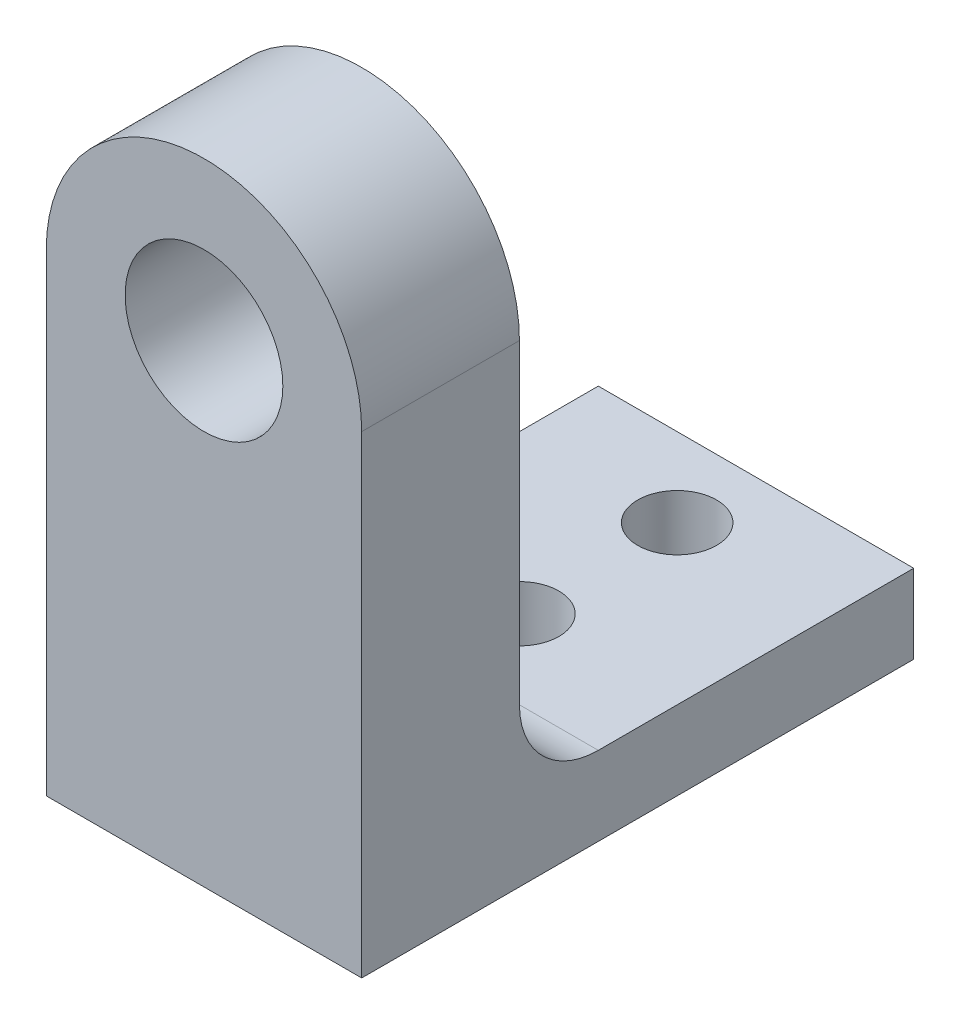
ISO-10303-21;
HEADER;
FILE_DESCRIPTION(('STEP AP214'),'2;1');
FILE_NAME('part.step','',(''),(''),'','','');
FILE_SCHEMA(('AUTOMOTIVE_DESIGN { 1 0 10303 214 1 1 1 1 }'));
ENDSEC;
DATA;
#1=APPLICATION_CONTEXT('core data for automotive mechanical design processes');
#2=APPLICATION_PROTOCOL_DEFINITION('international standard','automotive_design',2000,#1);
#3=PRODUCT_CONTEXT('',#1,'mechanical');
#4=PRODUCT('Part','Part','',(#3));
#5=PRODUCT_RELATED_PRODUCT_CATEGORY('part','',(#4));
#6=PRODUCT_DEFINITION_FORMATION('','',#4);
#7=PRODUCT_DEFINITION_CONTEXT('part definition',#1,'design');
#8=PRODUCT_DEFINITION('design','',#6,#7);
#9=PRODUCT_DEFINITION_SHAPE('','',#8);
#10=(LENGTH_UNIT() NAMED_UNIT(*) SI_UNIT(.MILLI.,.METRE.));
#11=(NAMED_UNIT(*) PLANE_ANGLE_UNIT() SI_UNIT($,.RADIAN.));
#12=(NAMED_UNIT(*) SI_UNIT($,.STERADIAN.) SOLID_ANGLE_UNIT());
#13=UNCERTAINTY_MEASURE_WITH_UNIT(LENGTH_MEASURE(1.E-05),#10,'distance_accuracy_value','');
#14=(GEOMETRIC_REPRESENTATION_CONTEXT(3) GLOBAL_UNCERTAINTY_ASSIGNED_CONTEXT((#13)) GLOBAL_UNIT_ASSIGNED_CONTEXT((#10,
#11,#12)) REPRESENTATION_CONTEXT('',''));
#15=CARTESIAN_POINT('',(0.,0.,0.));
#16=DIRECTION('',(0.,0.,1.));
#17=DIRECTION('',(1.,0.,0.));
#18=AXIS2_PLACEMENT_3D('',#15,#16,#17);
#19=CARTESIAN_POINT('',(25.4,12.7,-6.35));
#20=DIRECTION('',(-1.,0.,0.));
#21=DIRECTION('',(0.,0.,1.));
#22=AXIS2_PLACEMENT_3D('',#19,#20,#21);
#23=CYLINDRICAL_SURFACE('',#22,6.35);
#24=CARTESIAN_POINT('',(0.,12.7,-6.35));
#25=DIRECTION('',(1.,0.,0.));
#26=DIRECTION('',(0.,1.,0.));
#27=AXIS2_PLACEMENT_3D('',#24,#25,#26);
#28=CIRCLE('',#27,6.35);
#29=CARTESIAN_POINT('',(0.,12.7,0.));
#30=VERTEX_POINT('',#29);
#31=CARTESIAN_POINT('',(0.,6.35,-6.35000000000004));
#32=VERTEX_POINT('',#31);
#33=EDGE_CURVE('E35',#30,#32,#28,.T.);
#34=ORIENTED_EDGE('',*,*,#33,.F.);
#35=DIRECTION('',(-1.,0.,0.));
#36=VECTOR('',#35,1.);
#37=CARTESIAN_POINT('',(25.4,12.7,0.));
#38=LINE('',#37,#36);
#39=CARTESIAN_POINT('',(25.4,12.7,0.));
#40=VERTEX_POINT('',#39);
#41=EDGE_CURVE('E124',#40,#30,#38,.T.);
#42=ORIENTED_EDGE('',*,*,#41,.F.);
#43=CARTESIAN_POINT('',(25.4,12.7,-6.35));
#44=DIRECTION('',(1.,0.,0.));
#45=DIRECTION('',(0.,1.,0.));
#46=AXIS2_PLACEMENT_3D('',#43,#44,#45);
#47=CIRCLE('',#46,6.35);
#48=CARTESIAN_POINT('',(25.4,6.35,-6.35000000000004));
#49=VERTEX_POINT('',#48);
#50=EDGE_CURVE('E10',#40,#49,#47,.T.);
#51=ORIENTED_EDGE('',*,*,#50,.T.);
#52=DIRECTION('',(-1.,0.,0.));
#53=VECTOR('',#52,1.);
#54=CARTESIAN_POINT('',(25.4,6.35,-6.35000000000004));
#55=LINE('',#54,#53);
#56=EDGE_CURVE('E26',#49,#32,#55,.T.);
#57=ORIENTED_EDGE('',*,*,#56,.T.);
#58=EDGE_LOOP('',(#34,#42,#51,#57));
#59=FACE_BOUND('',#58,.T.);
#60=ADVANCED_FACE('F16',(#59),#23,.F.);
#61=CARTESIAN_POINT('',(25.4,0.,0.));
#62=DIRECTION('',(0.,0.,1.));
#63=DIRECTION('',(1.,0.,0.));
#64=AXIS2_PLACEMENT_3D('',#61,#62,#63);
#65=PLANE('',#64);
#66=CARTESIAN_POINT('',(12.7,38.1,0.));
#67=DIRECTION('',(0.,0.,-1.));
#68=DIRECTION('',(1.,0.,0.));
#69=AXIS2_PLACEMENT_3D('',#66,#67,#68);
#70=CIRCLE('',#69,12.7);
#71=CARTESIAN_POINT('',(0.,38.1,0.));
#72=VERTEX_POINT('',#71);
#73=CARTESIAN_POINT('',(25.4,38.1,0.));
#74=VERTEX_POINT('',#73);
#75=EDGE_CURVE('E120',#72,#74,#70,.T.);
#76=ORIENTED_EDGE('',*,*,#75,.T.);
#77=DIRECTION('',(0.,1.,0.));
#78=VECTOR('',#77,1.);
#79=CARTESIAN_POINT('',(25.4,12.7,0.));
#80=LINE('',#79,#78);
#81=EDGE_CURVE('E96',#40,#74,#80,.T.);
#82=ORIENTED_EDGE('',*,*,#81,.F.);
#83=ORIENTED_EDGE('',*,*,#41,.T.);
#84=DIRECTION('',(0.,1.,0.));
#85=VECTOR('',#84,1.);
#86=CARTESIAN_POINT('',(0.,12.7,0.));
#87=LINE('',#86,#85);
#88=EDGE_CURVE('E122',#30,#72,#87,.T.);
#89=ORIENTED_EDGE('',*,*,#88,.T.);
#90=EDGE_LOOP('',(#76,#82,#83,#89));
#91=FACE_BOUND('',#90,.T.);
#92=CARTESIAN_POINT('',(12.7,38.1,0.));
#93=DIRECTION('',(0.,0.,1.));
#94=DIRECTION('',(1.,0.,0.));
#95=AXIS2_PLACEMENT_3D('',#92,#93,#94);
#96=CIRCLE('',#95,6.35);
#97=CARTESIAN_POINT('',(19.05,38.1,0.));
#98=VERTEX_POINT('',#97);
#99=EDGE_CURVE('E125',#98,#98,#96,.T.);
#100=ORIENTED_EDGE('',*,*,#99,.T.);
#101=EDGE_LOOP('',(#100));
#102=FACE_BOUND('',#101,.T.);
#103=ADVANCED_FACE('F165',(#91,#102),#65,.F.);
#104=CARTESIAN_POINT('',(25.4,0.,12.7));
#105=DIRECTION('',(0.,0.,1.));
#106=DIRECTION('',(1.,0.,0.));
#107=AXIS2_PLACEMENT_3D('',#104,#105,#106);
#108=PLANE('',#107);
#109=DIRECTION('',(0.,1.,0.));
#110=VECTOR('',#109,1.);
#111=CARTESIAN_POINT('',(25.4,0.,12.7));
#112=LINE('',#111,#110);
#113=CARTESIAN_POINT('',(25.4,0.,12.7));
#114=VERTEX_POINT('',#113);
#115=CARTESIAN_POINT('',(25.4,38.1,12.7));
#116=VERTEX_POINT('',#115);
#117=EDGE_CURVE('E128',#114,#116,#112,.T.);
#118=ORIENTED_EDGE('',*,*,#117,.T.);
#119=CARTESIAN_POINT('',(12.7,38.1,12.7));
#120=DIRECTION('',(0.,0.,1.));
#121=DIRECTION('',(1.,0.,0.));
#122=AXIS2_PLACEMENT_3D('',#119,#120,#121);
#123=CIRCLE('',#122,12.7);
#124=CARTESIAN_POINT('',(0.,38.1,12.7));
#125=VERTEX_POINT('',#124);
#126=EDGE_CURVE('E131',#116,#125,#123,.T.);
#127=ORIENTED_EDGE('',*,*,#126,.T.);
#128=DIRECTION('',(0.,1.,0.));
#129=VECTOR('',#128,1.);
#130=CARTESIAN_POINT('',(0.,0.,12.7));
#131=LINE('',#130,#129);
#132=CARTESIAN_POINT('',(0.,0.,12.7));
#133=VERTEX_POINT('',#132);
#134=EDGE_CURVE('E90',#133,#125,#131,.T.);
#135=ORIENTED_EDGE('',*,*,#134,.F.);
#136=DIRECTION('',(-1.,0.,0.));
#137=VECTOR('',#136,1.);
#138=CARTESIAN_POINT('',(25.4,0.,12.7));
#139=LINE('',#138,#137);
#140=EDGE_CURVE('E135',#114,#133,#139,.T.);
#141=ORIENTED_EDGE('',*,*,#140,.F.);
#142=EDGE_LOOP('',(#118,#127,#135,#141));
#143=FACE_BOUND('',#142,.T.);
#144=CARTESIAN_POINT('',(12.7,38.1,12.7));
#145=DIRECTION('',(0.,0.,1.));
#146=DIRECTION('',(1.,0.,0.));
#147=AXIS2_PLACEMENT_3D('',#144,#145,#146);
#148=CIRCLE('',#147,6.35);
#149=CARTESIAN_POINT('',(19.05,38.1,12.7));
#150=VERTEX_POINT('',#149);
#151=EDGE_CURVE('E138',#150,#150,#148,.T.);
#152=ORIENTED_EDGE('',*,*,#151,.F.);
#153=EDGE_LOOP('',(#152));
#154=FACE_BOUND('',#153,.T.);
#155=ADVANCED_FACE('F156',(#143,#154),#108,.T.);
#156=CARTESIAN_POINT('',(25.4,0.,0.));
#157=DIRECTION('',(0.,-1.,0.));
#158=DIRECTION('',(0.,0.,-1.));
#159=AXIS2_PLACEMENT_3D('',#156,#157,#158);
#160=PLANE('',#159);
#161=DIRECTION('',(0.,0.,1.));
#162=VECTOR('',#161,1.);
#163=CARTESIAN_POINT('',(0.,0.,-31.75));
#164=LINE('',#163,#162);
#165=CARTESIAN_POINT('',(0.,0.,-31.75));
#166=VERTEX_POINT('',#165);
#167=EDGE_CURVE('E141',#166,#133,#164,.T.);
#168=ORIENTED_EDGE('',*,*,#167,.F.);
#169=DIRECTION('',(-1.,0.,0.));
#170=VECTOR('',#169,1.);
#171=CARTESIAN_POINT('',(25.4,0.,-31.75));
#172=LINE('',#171,#170);
#173=CARTESIAN_POINT('',(25.4,0.,-31.75));
#174=VERTEX_POINT('',#173);
#175=EDGE_CURVE('E100',#174,#166,#172,.T.);
#176=ORIENTED_EDGE('',*,*,#175,.F.);
#177=DIRECTION('',(0.,0.,1.));
#178=VECTOR('',#177,1.);
#179=CARTESIAN_POINT('',(25.4,0.,-31.75));
#180=LINE('',#179,#178);
#181=EDGE_CURVE('E86',#174,#114,#180,.T.);
#182=ORIENTED_EDGE('',*,*,#181,.T.);
#183=ORIENTED_EDGE('',*,*,#140,.T.);
#184=EDGE_LOOP('',(#168,#176,#182,#183));
#185=FACE_BOUND('',#184,.T.);
#186=CARTESIAN_POINT('',(12.7,0.,-12.7));
#187=DIRECTION('',(0.,-1.,0.));
#188=DIRECTION('',(0.,0.,-1.));
#189=AXIS2_PLACEMENT_3D('',#186,#187,#188);
#190=CIRCLE('',#189,3.175);
#191=CARTESIAN_POINT('',(12.7,0.,-15.875));
#192=VERTEX_POINT('',#191);
#193=EDGE_CURVE('E109',#192,#192,#190,.T.);
#194=ORIENTED_EDGE('',*,*,#193,.F.);
#195=EDGE_LOOP('',(#194));
#196=FACE_BOUND('',#195,.T.);
#197=CARTESIAN_POINT('',(12.7,0.,-25.4));
#198=DIRECTION('',(0.,-1.,0.));
#199=DIRECTION('',(0.,0.,-1.));
#200=AXIS2_PLACEMENT_3D('',#197,#198,#199);
#201=CIRCLE('',#200,3.175);
#202=CARTESIAN_POINT('',(12.7,0.,-28.575));
#203=VERTEX_POINT('',#202);
#204=EDGE_CURVE('E112',#203,#203,#201,.T.);
#205=ORIENTED_EDGE('',*,*,#204,.F.);
#206=EDGE_LOOP('',(#205));
#207=FACE_BOUND('',#206,.T.);
#208=ADVANCED_FACE('F154',(#185,#196,#207),#160,.T.);
#209=CARTESIAN_POINT('',(25.4,0.,-31.75));
#210=DIRECTION('',(0.,0.,1.));
#211=DIRECTION('',(1.,0.,0.));
#212=AXIS2_PLACEMENT_3D('',#209,#210,#211);
#213=PLANE('',#212);
#214=DIRECTION('',(0.,1.,0.));
#215=VECTOR('',#214,1.);
#216=CARTESIAN_POINT('',(0.,0.,-31.75));
#217=LINE('',#216,#215);
#218=CARTESIAN_POINT('',(0.,6.35,-31.75));
#219=VERTEX_POINT('',#218);
#220=EDGE_CURVE('E94',#166,#219,#217,.T.);
#221=ORIENTED_EDGE('',*,*,#220,.T.);
#222=DIRECTION('',(-1.,0.,0.));
#223=VECTOR('',#222,1.);
#224=CARTESIAN_POINT('',(25.4,6.35,-31.75));
#225=LINE('',#224,#223);
#226=CARTESIAN_POINT('',(25.4,6.35,-31.75));
#227=VERTEX_POINT('',#226);
#228=EDGE_CURVE('E73',#227,#219,#225,.T.);
#229=ORIENTED_EDGE('',*,*,#228,.F.);
#230=DIRECTION('',(0.,1.,0.));
#231=VECTOR('',#230,1.);
#232=CARTESIAN_POINT('',(25.4,0.,-31.75));
#233=LINE('',#232,#231);
#234=EDGE_CURVE('E80',#174,#227,#233,.T.);
#235=ORIENTED_EDGE('',*,*,#234,.F.);
#236=ORIENTED_EDGE('',*,*,#175,.T.);
#237=EDGE_LOOP('',(#221,#229,#235,#236));
#238=FACE_BOUND('',#237,.T.);
#239=ADVANCED_FACE('F92',(#238),#213,.F.);
#240=CARTESIAN_POINT('',(25.4,6.35,0.));
#241=DIRECTION('',(0.,1.,0.));
#242=DIRECTION('',(0.,0.,1.));
#243=AXIS2_PLACEMENT_3D('',#240,#241,#242);
#244=PLANE('',#243);
#245=DIRECTION('',(0.,0.,-1.));
#246=VECTOR('',#245,1.);
#247=CARTESIAN_POINT('',(0.,6.35,-6.35000000000004));
#248=LINE('',#247,#246);
#249=EDGE_CURVE('E105',#32,#219,#248,.T.);
#250=ORIENTED_EDGE('',*,*,#249,.F.);
#251=ORIENTED_EDGE('',*,*,#56,.F.);
#252=DIRECTION('',(0.,0.,-1.));
#253=VECTOR('',#252,1.);
#254=CARTESIAN_POINT('',(25.4,6.35,-6.35000000000004));
#255=LINE('',#254,#253);
#256=EDGE_CURVE('E83',#49,#227,#255,.T.);
#257=ORIENTED_EDGE('',*,*,#256,.T.);
#258=ORIENTED_EDGE('',*,*,#228,.T.);
#259=EDGE_LOOP('',(#250,#251,#257,#258));
#260=FACE_BOUND('',#259,.T.);
#261=CARTESIAN_POINT('',(12.7,6.35,-12.7));
#262=DIRECTION('',(0.,1.,0.));
#263=DIRECTION('',(1.,0.,0.));
#264=AXIS2_PLACEMENT_3D('',#261,#262,#263);
#265=CIRCLE('',#264,3.175);
#266=CARTESIAN_POINT('',(15.875,6.35,-12.7));
#267=VERTEX_POINT('',#266);
#268=EDGE_CURVE('E106',#267,#267,#265,.T.);
#269=ORIENTED_EDGE('',*,*,#268,.F.);
#270=EDGE_LOOP('',(#269));
#271=FACE_BOUND('',#270,.T.);
#272=CARTESIAN_POINT('',(12.7,6.35,-25.4));
#273=DIRECTION('',(0.,1.,0.));
#274=DIRECTION('',(1.,0.,0.));
#275=AXIS2_PLACEMENT_3D('',#272,#273,#274);
#276=CIRCLE('',#275,3.175);
#277=CARTESIAN_POINT('',(15.875,6.35,-25.4));
#278=VERTEX_POINT('',#277);
#279=EDGE_CURVE('E110',#278,#278,#276,.T.);
#280=ORIENTED_EDGE('',*,*,#279,.F.);
#281=EDGE_LOOP('',(#280));
#282=FACE_BOUND('',#281,.T.);
#283=ADVANCED_FACE('F98',(#260,#271,#282),#244,.T.);
#284=CARTESIAN_POINT('',(25.4,0.,0.));
#285=DIRECTION('',(1.,0.,0.));
#286=DIRECTION('',(0.,0.,-1.));
#287=AXIS2_PLACEMENT_3D('',#284,#285,#286);
#288=PLANE('',#287);
#289=ORIENTED_EDGE('',*,*,#81,.T.);
#290=DIRECTION('',(0.,0.,1.));
#291=VECTOR('',#290,1.);
#292=CARTESIAN_POINT('',(25.4,38.1,0.));
#293=LINE('',#292,#291);
#294=EDGE_CURVE('E89',#74,#116,#293,.T.);
#295=ORIENTED_EDGE('',*,*,#294,.T.);
#296=ORIENTED_EDGE('',*,*,#117,.F.);
#297=ORIENTED_EDGE('',*,*,#181,.F.);
#298=ORIENTED_EDGE('',*,*,#234,.T.);
#299=ORIENTED_EDGE('',*,*,#256,.F.);
#300=ORIENTED_EDGE('',*,*,#50,.F.);
#301=EDGE_LOOP('',(#289,#295,#296,#297,#298,#299,#300));
#302=FACE_BOUND('',#301,.T.);
#303=ADVANCED_FACE('F81',(#302),#288,.T.);
#304=CARTESIAN_POINT('',(0.,0.,0.));
#305=DIRECTION('',(1.,0.,0.));
#306=DIRECTION('',(0.,0.,-1.));
#307=AXIS2_PLACEMENT_3D('',#304,#305,#306);
#308=PLANE('',#307);
#309=ORIENTED_EDGE('',*,*,#134,.T.);
#310=DIRECTION('',(0.,0.,-1.));
#311=VECTOR('',#310,1.);
#312=CARTESIAN_POINT('',(0.,38.1,0.));
#313=LINE('',#312,#311);
#314=EDGE_CURVE('E20',#125,#72,#313,.T.);
#315=ORIENTED_EDGE('',*,*,#314,.T.);
#316=ORIENTED_EDGE('',*,*,#88,.F.);
#317=ORIENTED_EDGE('',*,*,#33,.T.);
#318=ORIENTED_EDGE('',*,*,#249,.T.);
#319=ORIENTED_EDGE('',*,*,#220,.F.);
#320=ORIENTED_EDGE('',*,*,#167,.T.);
#321=EDGE_LOOP('',(#309,#315,#316,#317,#318,#319,#320));
#322=FACE_BOUND('',#321,.T.);
#323=ADVANCED_FACE('F178',(#322),#308,.F.);
#324=CARTESIAN_POINT('',(12.7,38.1,0.));
#325=DIRECTION('',(0.,0.,1.));
#326=DIRECTION('',(1.,0.,0.));
#327=AXIS2_PLACEMENT_3D('',#324,#325,#326);
#328=CYLINDRICAL_SURFACE('',#327,12.7);
#329=ORIENTED_EDGE('',*,*,#75,.F.);
#330=ORIENTED_EDGE('',*,*,#314,.F.);
#331=ORIENTED_EDGE('',*,*,#126,.F.);
#332=ORIENTED_EDGE('',*,*,#294,.F.);
#333=EDGE_LOOP('',(#329,#330,#331,#332));
#334=FACE_BOUND('',#333,.T.);
#335=ADVANCED_FACE('F18',(#334),#328,.T.);
#336=CARTESIAN_POINT('',(12.7,38.1,-12.7));
#337=DIRECTION('',(0.,0.,1.));
#338=DIRECTION('',(1.,0.,0.));
#339=AXIS2_PLACEMENT_3D('',#336,#337,#338);
#340=CYLINDRICAL_SURFACE('',#339,6.35);
#341=ORIENTED_EDGE('',*,*,#151,.T.);
#342=EDGE_LOOP('',(#341));
#343=FACE_BOUND('',#342,.T.);
#344=ORIENTED_EDGE('',*,*,#99,.F.);
#345=EDGE_LOOP('',(#344));
#346=FACE_BOUND('',#345,.T.);
#347=ADVANCED_FACE('F183',(#343,#346),#340,.F.);
#348=CARTESIAN_POINT('',(12.7,-19.05,-25.4));
#349=DIRECTION('',(0.,1.,0.));
#350=DIRECTION('',(1.,0.,0.));
#351=AXIS2_PLACEMENT_3D('',#348,#349,#350);
#352=CYLINDRICAL_SURFACE('',#351,3.175);
#353=ORIENTED_EDGE('',*,*,#204,.T.);
#354=EDGE_LOOP('',(#353));
#355=FACE_BOUND('',#354,.T.);
#356=ORIENTED_EDGE('',*,*,#279,.T.);
#357=EDGE_LOOP('',(#356));
#358=FACE_BOUND('',#357,.T.);
#359=ADVANCED_FACE('F151',(#355,#358),#352,.F.);
#360=CARTESIAN_POINT('',(12.7,-19.05,-12.7));
#361=DIRECTION('',(0.,1.,0.));
#362=DIRECTION('',(1.,0.,0.));
#363=AXIS2_PLACEMENT_3D('',#360,#361,#362);
#364=CYLINDRICAL_SURFACE('',#363,3.175);
#365=ORIENTED_EDGE('',*,*,#193,.T.);
#366=EDGE_LOOP('',(#365));
#367=FACE_BOUND('',#366,.T.);
#368=ORIENTED_EDGE('',*,*,#268,.T.);
#369=EDGE_LOOP('',(#368));
#370=FACE_BOUND('',#369,.T.);
#371=ADVANCED_FACE('F182',(#367,#370),#364,.F.);
#372=CLOSED_SHELL('',(#60,#103,#155,#208,#239,#283,#303,#323,#335,#347,#359,#371));
#373=MANIFOLD_SOLID_BREP('B1',#372);
#374=ADVANCED_BREP_SHAPE_REPRESENTATION('',(#18,#373),#14);
#375=SHAPE_DEFINITION_REPRESENTATION(#9,#374);
ENDSEC;
END-ISO-10303-21;
